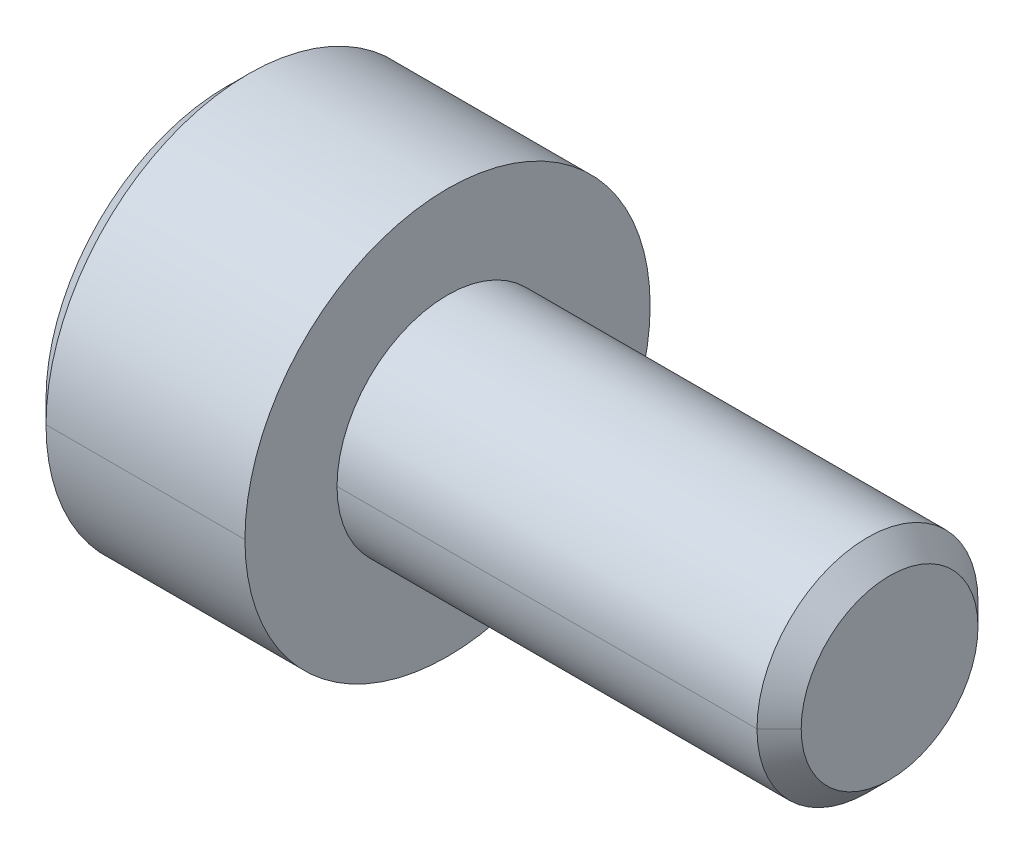
ISO-10303-21;
HEADER;
FILE_DESCRIPTION(('STEP AP214'),'2;1');
FILE_NAME('part.step','',(''),(''),'','','');
FILE_SCHEMA(('AUTOMOTIVE_DESIGN { 1 0 10303 214 1 1 1 1 }'));
ENDSEC;
DATA;
#1=APPLICATION_CONTEXT('core data for automotive mechanical design processes');
#2=APPLICATION_PROTOCOL_DEFINITION('international standard','automotive_design',2000,#1);
#3=PRODUCT_CONTEXT('',#1,'mechanical');
#4=PRODUCT('Part','Part','',(#3));
#5=PRODUCT_RELATED_PRODUCT_CATEGORY('part','',(#4));
#6=PRODUCT_DEFINITION_FORMATION('','',#4);
#7=PRODUCT_DEFINITION_CONTEXT('part definition',#1,'design');
#8=PRODUCT_DEFINITION('design','',#6,#7);
#9=PRODUCT_DEFINITION_SHAPE('','',#8);
#10=(LENGTH_UNIT() NAMED_UNIT(*) SI_UNIT(.MILLI.,.METRE.));
#11=(NAMED_UNIT(*) PLANE_ANGLE_UNIT() SI_UNIT($,.RADIAN.));
#12=(NAMED_UNIT(*) SI_UNIT($,.STERADIAN.) SOLID_ANGLE_UNIT());
#13=UNCERTAINTY_MEASURE_WITH_UNIT(LENGTH_MEASURE(1.E-05),#10,'distance_accuracy_value','');
#14=(GEOMETRIC_REPRESENTATION_CONTEXT(3) GLOBAL_UNCERTAINTY_ASSIGNED_CONTEXT((#13)) GLOBAL_UNIT_ASSIGNED_CONTEXT((#10,
#11,#12)) REPRESENTATION_CONTEXT('',''));
#15=CARTESIAN_POINT('',(0.,0.,0.));
#16=DIRECTION('',(0.,0.,1.));
#17=DIRECTION('',(1.,0.,0.));
#18=AXIS2_PLACEMENT_3D('',#15,#16,#17);
#19=CARTESIAN_POINT('',(-5.60793237971391,2.33117371369804,1.34590377113134));
#20=DIRECTION('',(0.901523057468274,-0.374756097535173,-0.216365533792385));
#21=DIRECTION('',(0.,0.5,-0.866025403784439));
#22=AXIS2_PLACEMENT_3D('',#19,#20,#21);
#23=PLANE('',#22);
#24=DIRECTION('',(0.383848537659809,0.461698034470699,0.799684453457937));
#25=VECTOR('',#24,1.);
#26=CARTESIAN_POINT('',(-7.5,-0.721687836487032,-1.25));
#27=LINE('',#26,#25);
#28=CARTESIAN_POINT('',(-7.5,-0.721687836487032,-1.25));
#29=VERTEX_POINT('',#28);
#30=CARTESIAN_POINT('',(-6.9,0.,0.));
#31=VERTEX_POINT('',#30);
#32=EDGE_CURVE('E136',#29,#31,#27,.T.);
#33=ORIENTED_EDGE('',*,*,#32,.F.);
#34=CARTESIAN_POINT('',(-7.5,-0.721687836487032,-1.25));
#35=CARTESIAN_POINT('',(-7.5,-0.962250448649377,-0.833333333333333));
#36=CARTESIAN_POINT('',(-7.5,-1.20281306081172,-0.416666666666666));
#37=CARTESIAN_POINT('',(-7.5,-1.44337567297406,0.));
#38=(BOUNDED_CURVE() B_SPLINE_CURVE(3,(#34,#35,#36,#37),.UNSPECIFIED.,.F.,
.F.) B_SPLINE_CURVE_WITH_KNOTS((4,4),(0.,1.),
.UNSPECIFIED.) CURVE() GEOMETRIC_REPRESENTATION_ITEM() RATIONAL_B_SPLINE_CURVE((1.,1.,1.,1.)) REPRESENTATION_ITEM(''));
#39=CARTESIAN_POINT('',(-7.5,-1.44337567297406,0.));
#40=VERTEX_POINT('',#39);
#41=EDGE_CURVE('E205',#29,#40,#38,.T.);
#42=ORIENTED_EDGE('',*,*,#41,.T.);
#43=DIRECTION('',(0.383848537659809,0.923396068941397,0.));
#44=VECTOR('',#43,1.);
#45=CARTESIAN_POINT('',(-7.5,-1.44337567297406,0.));
#46=LINE('',#45,#44);
#47=EDGE_CURVE('E10',#40,#31,#46,.T.);
#48=ORIENTED_EDGE('',*,*,#47,.T.);
#49=EDGE_LOOP('',(#33,#42,#48));
#50=FACE_BOUND('',#49,.T.);
#51=ADVANCED_FACE('F16',(#50),#23,.F.);
#52=CARTESIAN_POINT('',(-5.60793237971392,2.33117371369804,-1.34590377113134));
#53=DIRECTION('',(0.901523057468274,-0.374756097535173,0.216365533792385));
#54=DIRECTION('',(0.,-0.5,-0.866025403784439));
#55=AXIS2_PLACEMENT_3D('',#52,#53,#54);
#56=PLANE('',#55);
#57=ORIENTED_EDGE('',*,*,#47,.F.);
#58=CARTESIAN_POINT('',(-7.5,-1.44337567297406,0.));
#59=CARTESIAN_POINT('',(-7.5,-1.20281306081172,0.416666666666667));
#60=CARTESIAN_POINT('',(-7.5,-0.962250448649377,0.833333333333334));
#61=CARTESIAN_POINT('',(-7.5,-0.721687836487033,1.25));
#62=(BOUNDED_CURVE() B_SPLINE_CURVE(3,(#58,#59,#60,#61),.UNSPECIFIED.,.F.,
.F.) B_SPLINE_CURVE_WITH_KNOTS((4,4),(0.,1.),
.UNSPECIFIED.) CURVE() GEOMETRIC_REPRESENTATION_ITEM() RATIONAL_B_SPLINE_CURVE((1.,1.,1.,1.)) REPRESENTATION_ITEM(''));
#63=CARTESIAN_POINT('',(-7.5,-0.721687836487033,1.25));
#64=VERTEX_POINT('',#63);
#65=EDGE_CURVE('E137',#40,#64,#62,.T.);
#66=ORIENTED_EDGE('',*,*,#65,.T.);
#67=DIRECTION('',(0.383848537659809,0.461698034470699,-0.799684453457937));
#68=VECTOR('',#67,1.);
#69=CARTESIAN_POINT('',(-7.5,-0.721687836487033,1.25));
#70=LINE('',#69,#68);
#71=EDGE_CURVE('E27',#64,#31,#70,.T.);
#72=ORIENTED_EDGE('',*,*,#71,.T.);
#73=EDGE_LOOP('',(#57,#66,#72));
#74=FACE_BOUND('',#73,.T.);
#75=ADVANCED_FACE('F501',(#74),#56,.F.);
#76=CARTESIAN_POINT('',(-5.60793237971391,0.,-2.69180754226268));
#77=DIRECTION('',(0.901523057468274,0.,0.432731067584772));
#78=DIRECTION('',(0.,-1.,0.));
#79=AXIS2_PLACEMENT_3D('',#76,#77,#78);
#80=PLANE('',#79);
#81=ORIENTED_EDGE('',*,*,#71,.F.);
#82=CARTESIAN_POINT('',(-7.5,-0.721687836487033,1.25));
#83=CARTESIAN_POINT('',(-7.5,-0.240562612162345,1.25));
#84=CARTESIAN_POINT('',(-7.5,0.240562612162344,1.25));
#85=CARTESIAN_POINT('',(-7.5,0.721687836487033,1.25));
#86=(BOUNDED_CURVE() B_SPLINE_CURVE(3,(#82,#83,#84,#85),.UNSPECIFIED.,.F.,
.F.) B_SPLINE_CURVE_WITH_KNOTS((4,4),(0.,1.),
.UNSPECIFIED.) CURVE() GEOMETRIC_REPRESENTATION_ITEM() RATIONAL_B_SPLINE_CURVE((1.,1.,1.,1.)) REPRESENTATION_ITEM(''));
#87=CARTESIAN_POINT('',(-7.5,0.721687836487033,1.25));
#88=VERTEX_POINT('',#87);
#89=EDGE_CURVE('E196',#64,#88,#86,.T.);
#90=ORIENTED_EDGE('',*,*,#89,.T.);
#91=DIRECTION('',(0.383848537659809,-0.461698034470699,-0.799684453457937));
#92=VECTOR('',#91,1.);
#93=CARTESIAN_POINT('',(-7.5,0.721687836487033,1.25));
#94=LINE('',#93,#92);
#95=EDGE_CURVE('E132',#88,#31,#94,.T.);
#96=ORIENTED_EDGE('',*,*,#95,.T.);
#97=EDGE_LOOP('',(#81,#90,#96));
#98=FACE_BOUND('',#97,.T.);
#99=ADVANCED_FACE('F362',(#98),#80,.F.);
#100=CARTESIAN_POINT('',(-5.60793237971392,-2.33117371369804,-1.34590377113134));
#101=DIRECTION('',(0.901523057468274,0.374756097535173,0.216365533792385));
#102=DIRECTION('',(0.,0.5,-0.866025403784439));
#103=AXIS2_PLACEMENT_3D('',#100,#101,#102);
#104=PLANE('',#103);
#105=ORIENTED_EDGE('',*,*,#95,.F.);
#106=CARTESIAN_POINT('',(-7.5,0.721687836487033,1.25));
#107=CARTESIAN_POINT('',(-7.5,0.962250448649376,0.833333333333333));
#108=CARTESIAN_POINT('',(-7.5,1.20281306081172,0.416666666666666));
#109=CARTESIAN_POINT('',(-7.5,1.44337567297406,0.));
#110=(BOUNDED_CURVE() B_SPLINE_CURVE(3,(#106,#107,#108,#109),.UNSPECIFIED.,.F.,
.F.) B_SPLINE_CURVE_WITH_KNOTS((4,4),(0.,1.),
.UNSPECIFIED.) CURVE() GEOMETRIC_REPRESENTATION_ITEM() RATIONAL_B_SPLINE_CURVE((1.,1.,1.,1.)) REPRESENTATION_ITEM(''));
#111=CARTESIAN_POINT('',(-7.5,1.44337567297406,0.));
#112=VERTEX_POINT('',#111);
#113=EDGE_CURVE('E197',#88,#112,#110,.T.);
#114=ORIENTED_EDGE('',*,*,#113,.T.);
#115=DIRECTION('',(0.383848537659809,-0.923396068941397,0.));
#116=VECTOR('',#115,1.);
#117=CARTESIAN_POINT('',(-7.5,1.44337567297406,0.));
#118=LINE('',#117,#116);
#119=EDGE_CURVE('E154',#112,#31,#118,.T.);
#120=ORIENTED_EDGE('',*,*,#119,.T.);
#121=EDGE_LOOP('',(#105,#114,#120));
#122=FACE_BOUND('',#121,.T.);
#123=ADVANCED_FACE('F369',(#122),#104,.F.);
#124=CARTESIAN_POINT('',(-5.60793237971392,0.,2.69180754226268));
#125=DIRECTION('',(0.901523057468274,0.,-0.432731067584772));
#126=DIRECTION('',(0.,-1.,0.));
#127=AXIS2_PLACEMENT_3D('',#124,#125,#126);
#128=PLANE('',#127);
#129=DIRECTION('',(0.383848537659809,-0.461698034470699,0.799684453457937));
#130=VECTOR('',#129,1.);
#131=CARTESIAN_POINT('',(-7.5,0.721687836487033,-1.25));
#132=LINE('',#131,#130);
#133=CARTESIAN_POINT('',(-7.5,0.721687836487033,-1.25));
#134=VERTEX_POINT('',#133);
#135=EDGE_CURVE('E249',#134,#31,#132,.T.);
#136=ORIENTED_EDGE('',*,*,#135,.F.);
#137=CARTESIAN_POINT('',(-7.5,0.721687836487033,-1.25));
#138=CARTESIAN_POINT('',(-7.5,0.240562612162345,-1.25));
#139=CARTESIAN_POINT('',(-7.5,-0.240562612162344,-1.25));
#140=CARTESIAN_POINT('',(-7.5,-0.721687836487032,-1.25));
#141=(BOUNDED_CURVE() B_SPLINE_CURVE(3,(#137,#138,#139,#140),.UNSPECIFIED.,.F.,
.F.) B_SPLINE_CURVE_WITH_KNOTS((4,4),(0.,1.),
.UNSPECIFIED.) CURVE() GEOMETRIC_REPRESENTATION_ITEM() RATIONAL_B_SPLINE_CURVE((1.,1.,1.,1.)) REPRESENTATION_ITEM(''));
#142=EDGE_CURVE('E198',#134,#29,#141,.T.);
#143=ORIENTED_EDGE('',*,*,#142,.T.);
#144=ORIENTED_EDGE('',*,*,#32,.T.);
#145=EDGE_LOOP('',(#136,#143,#144));
#146=FACE_BOUND('',#145,.T.);
#147=ADVANCED_FACE('F494',(#146),#128,.F.);
#148=CARTESIAN_POINT('',(-5.60793237971392,-2.33117371369804,1.34590377113134));
#149=DIRECTION('',(0.901523057468274,0.374756097535173,-0.216365533792385));
#150=DIRECTION('',(0.,-0.5,-0.866025403784439));
#151=AXIS2_PLACEMENT_3D('',#148,#149,#150);
#152=PLANE('',#151);
#153=ORIENTED_EDGE('',*,*,#119,.F.);
#154=CARTESIAN_POINT('',(-7.5,1.44337567297406,0.));
#155=CARTESIAN_POINT('',(-7.5,1.20281306081172,-0.416666666666666));
#156=CARTESIAN_POINT('',(-7.5,0.962250448649376,-0.833333333333333));
#157=CARTESIAN_POINT('',(-7.5,0.721687836487033,-1.25));
#158=(BOUNDED_CURVE() B_SPLINE_CURVE(3,(#154,#155,#156,#157),.UNSPECIFIED.,.F.,
.F.) B_SPLINE_CURVE_WITH_KNOTS((4,4),(0.,1.),
.UNSPECIFIED.) CURVE() GEOMETRIC_REPRESENTATION_ITEM() RATIONAL_B_SPLINE_CURVE((1.,1.,1.,1.)) REPRESENTATION_ITEM(''));
#159=EDGE_CURVE('E145',#112,#134,#158,.T.);
#160=ORIENTED_EDGE('',*,*,#159,.T.);
#161=ORIENTED_EDGE('',*,*,#135,.T.);
#162=EDGE_LOOP('',(#153,#160,#161));
#163=FACE_BOUND('',#162,.T.);
#164=ADVANCED_FACE('F484',(#163),#152,.F.);
#165=CARTESIAN_POINT('',(-9.,0.,0.));
#166=DIRECTION('',(1.,0.,0.));
#167=DIRECTION('',(0.,0.,-1.));
#168=AXIS2_PLACEMENT_3D('',#165,#166,#167);
#169=CONICAL_SURFACE('',#168,2.45,0.78539816339745);
#170=DIRECTION('',(0.707106781186547,0.,0.707106781186549));
#171=VECTOR('',#170,1.);
#172=CARTESIAN_POINT('',(-9.,0.,2.45));
#173=LINE('',#172,#171);
#174=CARTESIAN_POINT('',(-9.,0.,2.45));
#175=VERTEX_POINT('',#174);
#176=CARTESIAN_POINT('',(-8.7,0.,2.75));
#177=VERTEX_POINT('',#176);
#178=EDGE_CURVE('E107',#175,#177,#173,.T.);
#179=ORIENTED_EDGE('',*,*,#178,.F.);
#180=CARTESIAN_POINT('',(-9.,0.,0.));
#181=DIRECTION('',(-1.,0.,0.));
#182=DIRECTION('',(0.,0.,-1.));
#183=AXIS2_PLACEMENT_3D('',#180,#181,#182);
#184=CIRCLE('',#183,2.45);
#185=CARTESIAN_POINT('',(-9.,0.,-2.45));
#186=VERTEX_POINT('',#185);
#187=EDGE_CURVE('E93',#186,#175,#184,.T.);
#188=ORIENTED_EDGE('',*,*,#187,.F.);
#189=DIRECTION('',(0.707106781186547,0.,-0.707106781186549));
#190=VECTOR('',#189,1.);
#191=CARTESIAN_POINT('',(-9.,0.,-2.45));
#192=LINE('',#191,#190);
#193=CARTESIAN_POINT('',(-8.7,0.,-2.75));
#194=VERTEX_POINT('',#193);
#195=EDGE_CURVE('E117',#186,#194,#192,.T.);
#196=ORIENTED_EDGE('',*,*,#195,.T.);
#197=CARTESIAN_POINT('',(-8.7,0.,0.));
#198=DIRECTION('',(1.,0.,0.));
#199=DIRECTION('',(0.,0.,-1.));
#200=AXIS2_PLACEMENT_3D('',#197,#198,#199);
#201=CIRCLE('',#200,2.75);
#202=EDGE_CURVE('E103',#177,#194,#201,.T.);
#203=ORIENTED_EDGE('',*,*,#202,.F.);
#204=EDGE_LOOP('',(#179,#188,#196,#203));
#205=FACE_BOUND('',#204,.T.);
#206=ADVANCED_FACE('F108',(#205),#169,.T.);
#207=CARTESIAN_POINT('',(-7.5,1.44337567297406,0.));
#208=DIRECTION('',(0.,0.866025403784439,-0.5));
#209=DIRECTION('',(-1.,0.,0.));
#210=AXIS2_PLACEMENT_3D('',#207,#208,#209);
#211=PLANE('',#210);
#212=DIRECTION('',(0.,-0.5,-0.866025403784439));
#213=VECTOR('',#212,1.);
#214=CARTESIAN_POINT('',(-9.,1.44337567297406,0.));
#215=LINE('',#214,#213);
#216=CARTESIAN_POINT('',(-9.,1.44337567297406,0.));
#217=VERTEX_POINT('',#216);
#218=CARTESIAN_POINT('',(-9.,0.721687836487033,-1.25));
#219=VERTEX_POINT('',#218);
#220=EDGE_CURVE('E102',#217,#219,#215,.T.);
#221=ORIENTED_EDGE('',*,*,#220,.T.);
#222=DIRECTION('',(-1.,0.,0.));
#223=VECTOR('',#222,1.);
#224=CARTESIAN_POINT('',(-7.5,0.721687836487033,-1.25));
#225=LINE('',#224,#223);
#226=EDGE_CURVE('E155',#134,#219,#225,.T.);
#227=ORIENTED_EDGE('',*,*,#226,.F.);
#228=ORIENTED_EDGE('',*,*,#159,.F.);
#229=DIRECTION('',(-1.,0.,0.));
#230=VECTOR('',#229,1.);
#231=CARTESIAN_POINT('',(-7.5,1.44337567297406,0.));
#232=LINE('',#231,#230);
#233=EDGE_CURVE('E232',#112,#217,#232,.T.);
#234=ORIENTED_EDGE('',*,*,#233,.T.);
#235=EDGE_LOOP('',(#221,#227,#228,#234));
#236=FACE_BOUND('',#235,.T.);
#237=ADVANCED_FACE('F18',(#236),#211,.F.);
#238=CARTESIAN_POINT('',(-7.5,0.721687836487033,-1.25));
#239=DIRECTION('',(0.,0.,-1.));
#240=DIRECTION('',(0.,-1.,0.));
#241=AXIS2_PLACEMENT_3D('',#238,#239,#240);
#242=PLANE('',#241);
#243=DIRECTION('',(0.,-1.,0.));
#244=VECTOR('',#243,1.);
#245=CARTESIAN_POINT('',(-9.,0.721687836487033,-1.25));
#246=LINE('',#245,#244);
#247=CARTESIAN_POINT('',(-9.,-0.721687836487032,-1.25));
#248=VERTEX_POINT('',#247);
#249=EDGE_CURVE('E239',#219,#248,#246,.T.);
#250=ORIENTED_EDGE('',*,*,#249,.T.);
#251=DIRECTION('',(-1.,0.,0.));
#252=VECTOR('',#251,1.);
#253=CARTESIAN_POINT('',(-7.5,-0.721687836487032,-1.25));
#254=LINE('',#253,#252);
#255=EDGE_CURVE('E204',#29,#248,#254,.T.);
#256=ORIENTED_EDGE('',*,*,#255,.F.);
#257=ORIENTED_EDGE('',*,*,#142,.F.);
#258=ORIENTED_EDGE('',*,*,#226,.T.);
#259=EDGE_LOOP('',(#250,#256,#257,#258));
#260=FACE_BOUND('',#259,.T.);
#261=ADVANCED_FACE('F312',(#260),#242,.F.);
#262=CARTESIAN_POINT('',(-7.5,-0.721687836487032,-1.25));
#263=DIRECTION('',(0.,-0.866025403784439,-0.5));
#264=DIRECTION('',(0.,0.5,-0.866025403784439));
#265=AXIS2_PLACEMENT_3D('',#262,#263,#264);
#266=PLANE('',#265);
#267=DIRECTION('',(0.,-0.5,0.866025403784439));
#268=VECTOR('',#267,1.);
#269=CARTESIAN_POINT('',(-9.,-0.721687836487032,-1.25));
#270=LINE('',#269,#268);
#271=CARTESIAN_POINT('',(-9.,-1.44337567297406,0.));
#272=VERTEX_POINT('',#271);
#273=EDGE_CURVE('E131',#248,#272,#270,.T.);
#274=ORIENTED_EDGE('',*,*,#273,.T.);
#275=DIRECTION('',(-1.,0.,0.));
#276=VECTOR('',#275,1.);
#277=CARTESIAN_POINT('',(-7.5,-1.44337567297406,0.));
#278=LINE('',#277,#276);
#279=EDGE_CURVE('E143',#40,#272,#278,.T.);
#280=ORIENTED_EDGE('',*,*,#279,.F.);
#281=ORIENTED_EDGE('',*,*,#41,.F.);
#282=ORIENTED_EDGE('',*,*,#255,.T.);
#283=EDGE_LOOP('',(#274,#280,#281,#282));
#284=FACE_BOUND('',#283,.T.);
#285=ADVANCED_FACE('F544',(#284),#266,.F.);
#286=CARTESIAN_POINT('',(-7.5,-1.44337567297406,0.));
#287=DIRECTION('',(0.,-0.866025403784439,0.5));
#288=DIRECTION('',(-1.,0.,0.));
#289=AXIS2_PLACEMENT_3D('',#286,#287,#288);
#290=PLANE('',#289);
#291=DIRECTION('',(0.,0.5,0.866025403784439));
#292=VECTOR('',#291,1.);
#293=CARTESIAN_POINT('',(-9.,-1.44337567297406,0.));
#294=LINE('',#293,#292);
#295=CARTESIAN_POINT('',(-9.,-0.721687836487033,1.25));
#296=VERTEX_POINT('',#295);
#297=EDGE_CURVE('E127',#272,#296,#294,.T.);
#298=ORIENTED_EDGE('',*,*,#297,.T.);
#299=DIRECTION('',(-1.,0.,0.));
#300=VECTOR('',#299,1.);
#301=CARTESIAN_POINT('',(-7.5,-0.721687836487033,1.25));
#302=LINE('',#301,#300);
#303=EDGE_CURVE('E144',#64,#296,#302,.T.);
#304=ORIENTED_EDGE('',*,*,#303,.F.);
#305=ORIENTED_EDGE('',*,*,#65,.F.);
#306=ORIENTED_EDGE('',*,*,#279,.T.);
#307=EDGE_LOOP('',(#298,#304,#305,#306));
#308=FACE_BOUND('',#307,.T.);
#309=ADVANCED_FACE('F581',(#308),#290,.F.);
#310=CARTESIAN_POINT('',(-7.5,-0.721687836487033,1.25));
#311=DIRECTION('',(0.,0.,1.));
#312=DIRECTION('',(1.,0.,0.));
#313=AXIS2_PLACEMENT_3D('',#310,#311,#312);
#314=PLANE('',#313);
#315=DIRECTION('',(0.,1.,0.));
#316=VECTOR('',#315,1.);
#317=CARTESIAN_POINT('',(-9.,-0.721687836487033,1.25));
#318=LINE('',#317,#316);
#319=CARTESIAN_POINT('',(-9.,0.721687836487033,1.25));
#320=VERTEX_POINT('',#319);
#321=EDGE_CURVE('E125',#296,#320,#318,.T.);
#322=ORIENTED_EDGE('',*,*,#321,.T.);
#323=DIRECTION('',(-1.,0.,0.));
#324=VECTOR('',#323,1.);
#325=CARTESIAN_POINT('',(-7.5,0.721687836487033,1.25));
#326=LINE('',#325,#324);
#327=EDGE_CURVE('E192',#88,#320,#326,.T.);
#328=ORIENTED_EDGE('',*,*,#327,.F.);
#329=ORIENTED_EDGE('',*,*,#89,.F.);
#330=ORIENTED_EDGE('',*,*,#303,.T.);
#331=EDGE_LOOP('',(#322,#328,#329,#330));
#332=FACE_BOUND('',#331,.T.);
#333=ADVANCED_FACE('F364',(#332),#314,.F.);
#334=CARTESIAN_POINT('',(-7.5,0.721687836487033,1.25));
#335=DIRECTION('',(0.,0.866025403784439,0.5));
#336=DIRECTION('',(1.,0.,0.));
#337=AXIS2_PLACEMENT_3D('',#334,#335,#336);
#338=PLANE('',#337);
#339=DIRECTION('',(0.,0.5,-0.866025403784439));
#340=VECTOR('',#339,1.);
#341=CARTESIAN_POINT('',(-9.,0.721687836487033,1.25));
#342=LINE('',#341,#340);
#343=EDGE_CURVE('E327',#320,#217,#342,.T.);
#344=ORIENTED_EDGE('',*,*,#343,.T.);
#345=ORIENTED_EDGE('',*,*,#233,.F.);
#346=ORIENTED_EDGE('',*,*,#113,.F.);
#347=ORIENTED_EDGE('',*,*,#327,.T.);
#348=EDGE_LOOP('',(#344,#345,#346,#347));
#349=FACE_BOUND('',#348,.T.);
#350=ADVANCED_FACE('F366',(#349),#338,.F.);
#351=CARTESIAN_POINT('',(-0.3,0.,0.));
#352=DIRECTION('',(-1.,0.,0.));
#353=DIRECTION('',(0.,0.,1.));
#354=AXIS2_PLACEMENT_3D('',#351,#352,#353);
#355=CONICAL_SURFACE('',#354,1.5,0.78539816339745);
#356=DIRECTION('',(-0.707106781186547,0.,-0.707106781186549));
#357=VECTOR('',#356,1.);
#358=CARTESIAN_POINT('',(-0.3,0.,-1.5));
#359=LINE('',#358,#357);
#360=CARTESIAN_POINT('',(0.,0.,-1.2));
#361=VERTEX_POINT('',#360);
#362=CARTESIAN_POINT('',(-0.3,0.,-1.5));
#363=VERTEX_POINT('',#362);
#364=EDGE_CURVE('E164',#361,#363,#359,.T.);
#365=ORIENTED_EDGE('',*,*,#364,.F.);
#366=CARTESIAN_POINT('',(0.,0.,0.));
#367=DIRECTION('',(1.,0.,0.));
#368=DIRECTION('',(0.,0.,1.));
#369=AXIS2_PLACEMENT_3D('',#366,#367,#368);
#370=CIRCLE('',#369,1.2);
#371=CARTESIAN_POINT('',(0.,0.,1.2));
#372=VERTEX_POINT('',#371);
#373=EDGE_CURVE('E220',#372,#361,#370,.T.);
#374=ORIENTED_EDGE('',*,*,#373,.F.);
#375=DIRECTION('',(-0.707106781186547,0.,0.707106781186549));
#376=VECTOR('',#375,1.);
#377=CARTESIAN_POINT('',(-0.3,0.,1.5));
#378=LINE('',#377,#376);
#379=CARTESIAN_POINT('',(-0.3,0.,1.5));
#380=VERTEX_POINT('',#379);
#381=EDGE_CURVE('E169',#372,#380,#378,.T.);
#382=ORIENTED_EDGE('',*,*,#381,.T.);
#383=CARTESIAN_POINT('',(-0.3,0.,0.));
#384=DIRECTION('',(-1.,0.,0.));
#385=DIRECTION('',(0.,0.,1.));
#386=AXIS2_PLACEMENT_3D('',#383,#384,#385);
#387=CIRCLE('',#386,1.5);
#388=EDGE_CURVE('E213',#363,#380,#387,.T.);
#389=ORIENTED_EDGE('',*,*,#388,.F.);
#390=EDGE_LOOP('',(#365,#374,#382,#389));
#391=FACE_BOUND('',#390,.T.);
#392=ADVANCED_FACE('F571',(#391),#355,.T.);
#393=CARTESIAN_POINT('',(-9.,2.75,0.));
#394=DIRECTION('',(1.,0.,0.));
#395=DIRECTION('',(0.,1.,0.));
#396=AXIS2_PLACEMENT_3D('',#393,#394,#395);
#397=PLANE('',#396);
#398=ORIENTED_EDGE('',*,*,#220,.F.);
#399=ORIENTED_EDGE('',*,*,#343,.F.);
#400=ORIENTED_EDGE('',*,*,#321,.F.);
#401=ORIENTED_EDGE('',*,*,#297,.F.);
#402=ORIENTED_EDGE('',*,*,#273,.F.);
#403=ORIENTED_EDGE('',*,*,#249,.F.);
#404=EDGE_LOOP('',(#398,#399,#400,#401,#402,#403));
#405=FACE_BOUND('',#404,.T.);
#406=ORIENTED_EDGE('',*,*,#187,.T.);
#407=CARTESIAN_POINT('',(-9.,0.,0.));
#408=DIRECTION('',(-1.,0.,0.));
#409=DIRECTION('',(0.,0.,-1.));
#410=AXIS2_PLACEMENT_3D('',#407,#408,#409);
#411=CIRCLE('',#410,2.45);
#412=EDGE_CURVE('E97',#175,#186,#411,.T.);
#413=ORIENTED_EDGE('',*,*,#412,.T.);
#414=EDGE_LOOP('',(#406,#413));
#415=FACE_BOUND('',#414,.T.);
#416=ADVANCED_FACE('F95',(#405,#415),#397,.F.);
#417=CARTESIAN_POINT('',(0.,0.,0.));
#418=DIRECTION('',(-1.,0.,0.));
#419=DIRECTION('',(0.,0.,1.));
#420=AXIS2_PLACEMENT_3D('',#417,#418,#419);
#421=CYLINDRICAL_SURFACE('',#420,2.75);
#422=DIRECTION('',(-1.,0.,0.));
#423=VECTOR('',#422,1.);
#424=CARTESIAN_POINT('',(0.,0.,-2.75));
#425=LINE('',#424,#423);
#426=CARTESIAN_POINT('',(-6.,0.,-2.75));
#427=VERTEX_POINT('',#426);
#428=EDGE_CURVE('E181',#427,#194,#425,.T.);
#429=ORIENTED_EDGE('',*,*,#428,.F.);
#430=CARTESIAN_POINT('',(-6.,0.,0.));
#431=DIRECTION('',(-1.,0.,0.));
#432=DIRECTION('',(0.,0.,1.));
#433=AXIS2_PLACEMENT_3D('',#430,#431,#432);
#434=CIRCLE('',#433,2.75);
#435=CARTESIAN_POINT('',(-6.,0.,2.75));
#436=VERTEX_POINT('',#435);
#437=EDGE_CURVE('E344',#427,#436,#434,.T.);
#438=ORIENTED_EDGE('',*,*,#437,.T.);
#439=DIRECTION('',(-1.,0.,0.));
#440=VECTOR('',#439,1.);
#441=CARTESIAN_POINT('',(0.,0.,2.75));
#442=LINE('',#441,#440);
#443=EDGE_CURVE('E20',#436,#177,#442,.T.);
#444=ORIENTED_EDGE('',*,*,#443,.T.);
#445=ORIENTED_EDGE('',*,*,#202,.T.);
#446=EDGE_LOOP('',(#429,#438,#444,#445));
#447=FACE_BOUND('',#446,.T.);
#448=ADVANCED_FACE('F561',(#447),#421,.T.);
#449=CARTESIAN_POINT('',(-6.,1.5,0.));
#450=DIRECTION('',(-1.,0.,0.));
#451=DIRECTION('',(0.,0.,1.));
#452=AXIS2_PLACEMENT_3D('',#449,#450,#451);
#453=PLANE('',#452);
#454=CARTESIAN_POINT('',(-6.,0.,0.));
#455=DIRECTION('',(-1.,0.,0.));
#456=DIRECTION('',(0.,0.,1.));
#457=AXIS2_PLACEMENT_3D('',#454,#455,#456);
#458=CIRCLE('',#457,1.5);
#459=CARTESIAN_POINT('',(-6.,0.,1.5));
#460=VERTEX_POINT('',#459);
#461=CARTESIAN_POINT('',(-6.,0.,-1.5));
#462=VERTEX_POINT('',#461);
#463=EDGE_CURVE('E163',#460,#462,#458,.T.);
#464=ORIENTED_EDGE('',*,*,#463,.T.);
#465=CARTESIAN_POINT('',(-6.,0.,0.));
#466=DIRECTION('',(-1.,0.,0.));
#467=DIRECTION('',(0.,0.,1.));
#468=AXIS2_PLACEMENT_3D('',#465,#466,#467);
#469=CIRCLE('',#468,1.5);
#470=EDGE_CURVE('E219',#462,#460,#469,.T.);
#471=ORIENTED_EDGE('',*,*,#470,.T.);
#472=EDGE_LOOP('',(#464,#471));
#473=FACE_BOUND('',#472,.T.);
#474=CARTESIAN_POINT('',(-6.,0.,0.));
#475=DIRECTION('',(-1.,0.,0.));
#476=DIRECTION('',(0.,0.,1.));
#477=AXIS2_PLACEMENT_3D('',#474,#475,#476);
#478=CIRCLE('',#477,2.75);
#479=EDGE_CURVE('E172',#436,#427,#478,.T.);
#480=ORIENTED_EDGE('',*,*,#479,.F.);
#481=ORIENTED_EDGE('',*,*,#437,.F.);
#482=EDGE_LOOP('',(#480,#481));
#483=FACE_BOUND('',#482,.T.);
#484=ADVANCED_FACE('F388',(#473,#483),#453,.F.);
#485=CARTESIAN_POINT('',(0.,0.,0.));
#486=DIRECTION('',(-1.,0.,0.));
#487=DIRECTION('',(0.,0.,1.));
#488=AXIS2_PLACEMENT_3D('',#485,#486,#487);
#489=CYLINDRICAL_SURFACE('',#488,1.5);
#490=DIRECTION('',(-1.,0.,0.));
#491=VECTOR('',#490,1.);
#492=CARTESIAN_POINT('',(0.,0.,-1.5));
#493=LINE('',#492,#491);
#494=EDGE_CURVE('E156',#363,#462,#493,.T.);
#495=ORIENTED_EDGE('',*,*,#494,.F.);
#496=ORIENTED_EDGE('',*,*,#388,.T.);
#497=DIRECTION('',(-1.,0.,0.));
#498=VECTOR('',#497,1.);
#499=CARTESIAN_POINT('',(0.,0.,1.5));
#500=LINE('',#499,#498);
#501=EDGE_CURVE('E243',#380,#460,#500,.T.);
#502=ORIENTED_EDGE('',*,*,#501,.T.);
#503=ORIENTED_EDGE('',*,*,#470,.F.);
#504=EDGE_LOOP('',(#495,#496,#502,#503));
#505=FACE_BOUND('',#504,.T.);
#506=ADVANCED_FACE('F385',(#505),#489,.T.);
#507=CARTESIAN_POINT('',(0.,0.,0.));
#508=DIRECTION('',(-1.,0.,0.));
#509=DIRECTION('',(0.,0.,1.));
#510=AXIS2_PLACEMENT_3D('',#507,#508,#509);
#511=PLANE('',#510);
#512=ORIENTED_EDGE('',*,*,#373,.T.);
#513=CARTESIAN_POINT('',(0.,0.,0.));
#514=DIRECTION('',(1.,0.,0.));
#515=DIRECTION('',(0.,0.,1.));
#516=AXIS2_PLACEMENT_3D('',#513,#514,#515);
#517=CIRCLE('',#516,1.2);
#518=EDGE_CURVE('E168',#361,#372,#517,.T.);
#519=ORIENTED_EDGE('',*,*,#518,.T.);
#520=EDGE_LOOP('',(#512,#519));
#521=FACE_BOUND('',#520,.T.);
#522=ADVANCED_FACE('F474',(#521),#511,.F.);
#523=CARTESIAN_POINT('',(0.,0.,0.));
#524=DIRECTION('',(-1.,0.,0.));
#525=DIRECTION('',(0.,0.,1.));
#526=AXIS2_PLACEMENT_3D('',#523,#524,#525);
#527=CYLINDRICAL_SURFACE('',#526,1.5);
#528=CARTESIAN_POINT('',(-0.3,0.,0.));
#529=DIRECTION('',(-1.,0.,0.));
#530=DIRECTION('',(0.,0.,1.));
#531=AXIS2_PLACEMENT_3D('',#528,#529,#530);
#532=CIRCLE('',#531,1.5);
#533=EDGE_CURVE('E167',#380,#363,#532,.T.);
#534=ORIENTED_EDGE('',*,*,#533,.T.);
#535=ORIENTED_EDGE('',*,*,#494,.T.);
#536=ORIENTED_EDGE('',*,*,#463,.F.);
#537=ORIENTED_EDGE('',*,*,#501,.F.);
#538=EDGE_LOOP('',(#534,#535,#536,#537));
#539=FACE_BOUND('',#538,.T.);
#540=ADVANCED_FACE('F386',(#539),#527,.T.);
#541=CARTESIAN_POINT('',(0.,0.,0.));
#542=DIRECTION('',(-1.,0.,0.));
#543=DIRECTION('',(0.,0.,1.));
#544=AXIS2_PLACEMENT_3D('',#541,#542,#543);
#545=CYLINDRICAL_SURFACE('',#544,2.75);
#546=ORIENTED_EDGE('',*,*,#479,.T.);
#547=ORIENTED_EDGE('',*,*,#428,.T.);
#548=CARTESIAN_POINT('',(-8.7,0.,0.));
#549=DIRECTION('',(1.,0.,0.));
#550=DIRECTION('',(0.,0.,-1.));
#551=AXIS2_PLACEMENT_3D('',#548,#549,#550);
#552=CIRCLE('',#551,2.75);
#553=EDGE_CURVE('E114',#194,#177,#552,.T.);
#554=ORIENTED_EDGE('',*,*,#553,.T.);
#555=ORIENTED_EDGE('',*,*,#443,.F.);
#556=EDGE_LOOP('',(#546,#547,#554,#555));
#557=FACE_BOUND('',#556,.T.);
#558=ADVANCED_FACE('F258',(#557),#545,.T.);
#559=CARTESIAN_POINT('',(-0.3,0.,0.));
#560=DIRECTION('',(-1.,0.,0.));
#561=DIRECTION('',(0.,0.,1.));
#562=AXIS2_PLACEMENT_3D('',#559,#560,#561);
#563=CONICAL_SURFACE('',#562,1.5,0.78539816339745);
#564=ORIENTED_EDGE('',*,*,#518,.F.);
#565=ORIENTED_EDGE('',*,*,#364,.T.);
#566=ORIENTED_EDGE('',*,*,#533,.F.);
#567=ORIENTED_EDGE('',*,*,#381,.F.);
#568=EDGE_LOOP('',(#564,#565,#566,#567));
#569=FACE_BOUND('',#568,.T.);
#570=ADVANCED_FACE('F515',(#569),#563,.T.);
#571=CARTESIAN_POINT('',(-9.,0.,0.));
#572=DIRECTION('',(1.,0.,0.));
#573=DIRECTION('',(0.,0.,-1.));
#574=AXIS2_PLACEMENT_3D('',#571,#572,#573);
#575=CONICAL_SURFACE('',#574,2.45,0.78539816339745);
#576=ORIENTED_EDGE('',*,*,#412,.F.);
#577=ORIENTED_EDGE('',*,*,#178,.T.);
#578=ORIENTED_EDGE('',*,*,#553,.F.);
#579=ORIENTED_EDGE('',*,*,#195,.F.);
#580=EDGE_LOOP('',(#576,#577,#578,#579));
#581=FACE_BOUND('',#580,.T.);
#582=ADVANCED_FACE('F116',(#581),#575,.T.);
#583=CLOSED_SHELL('',(#51,#75,#99,#123,#147,#164,#206,#237,#261,#285,#309,#333,#350,#392,#416,
#448,#484,#506,#522,#540,#558,#570,#582));
#584=MANIFOLD_SOLID_BREP('B1',#583);
#585=ADVANCED_BREP_SHAPE_REPRESENTATION('',(#18,#584),#14);
#586=SHAPE_DEFINITION_REPRESENTATION(#9,#585);
ENDSEC;
END-ISO-10303-21;
